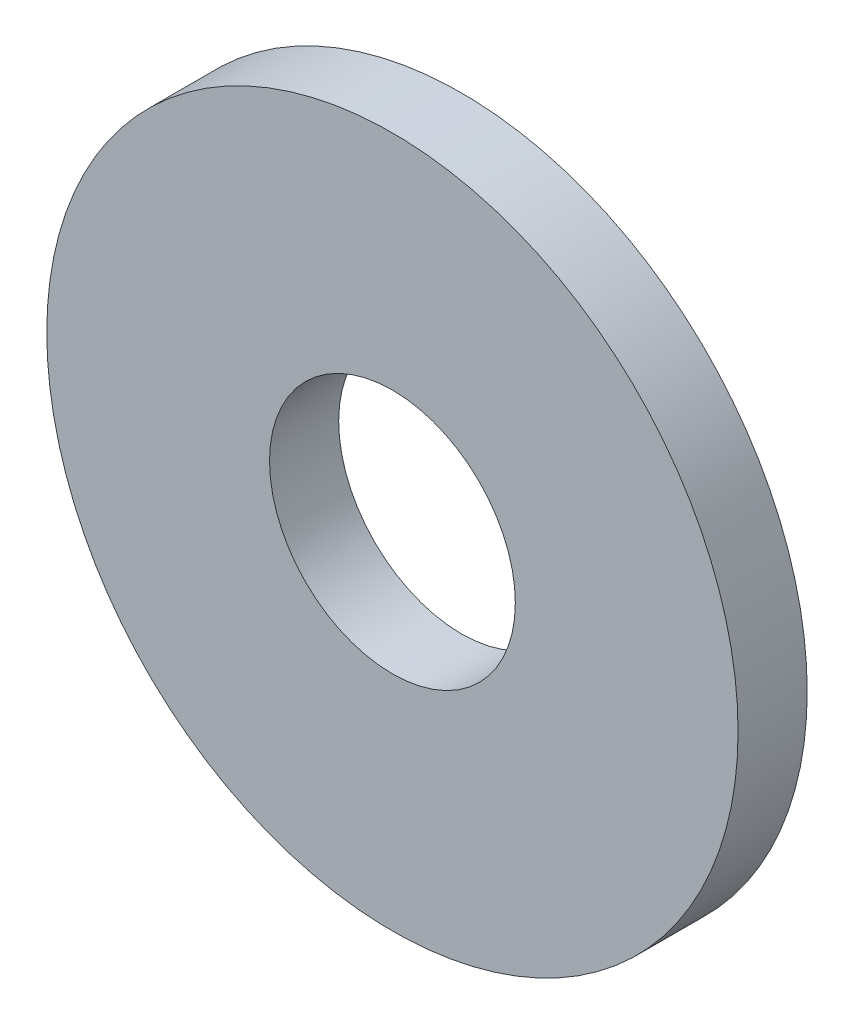
ISO-10303-21;
HEADER;
FILE_DESCRIPTION(('STEP AP214'),'2;1');
FILE_NAME('part.step','',(''),(''),'','','');
FILE_SCHEMA(('AUTOMOTIVE_DESIGN { 1 0 10303 214 1 1 1 1 }'));
ENDSEC;
DATA;
#1=APPLICATION_CONTEXT('core data for automotive mechanical design processes');
#2=APPLICATION_PROTOCOL_DEFINITION('international standard','automotive_design',2000,#1);
#3=PRODUCT_CONTEXT('',#1,'mechanical');
#4=PRODUCT('Part','Part','',(#3));
#5=PRODUCT_RELATED_PRODUCT_CATEGORY('part','',(#4));
#6=PRODUCT_DEFINITION_FORMATION('','',#4);
#7=PRODUCT_DEFINITION_CONTEXT('part definition',#1,'design');
#8=PRODUCT_DEFINITION('design','',#6,#7);
#9=PRODUCT_DEFINITION_SHAPE('','',#8);
#10=(LENGTH_UNIT() NAMED_UNIT(*) SI_UNIT(.MILLI.,.METRE.));
#11=(NAMED_UNIT(*) PLANE_ANGLE_UNIT() SI_UNIT($,.RADIAN.));
#12=(NAMED_UNIT(*) SI_UNIT($,.STERADIAN.) SOLID_ANGLE_UNIT());
#13=UNCERTAINTY_MEASURE_WITH_UNIT(LENGTH_MEASURE(1.E-05),#10,'distance_accuracy_value','');
#14=(GEOMETRIC_REPRESENTATION_CONTEXT(3) GLOBAL_UNCERTAINTY_ASSIGNED_CONTEXT((#13)) GLOBAL_UNIT_ASSIGNED_CONTEXT((#10,
#11,#12)) REPRESENTATION_CONTEXT('',''));
#15=CARTESIAN_POINT('',(0.,0.,0.));
#16=DIRECTION('',(0.,0.,1.));
#17=DIRECTION('',(1.,0.,0.));
#18=AXIS2_PLACEMENT_3D('',#15,#16,#17);
#19=CARTESIAN_POINT('',(0.,0.,1.8));
#20=DIRECTION('',(0.,0.,1.));
#21=DIRECTION('',(1.,0.,0.));
#22=AXIS2_PLACEMENT_3D('',#19,#20,#21);
#23=PLANE('',#22);
#24=CARTESIAN_POINT('',(0.,0.,1.8));
#25=DIRECTION('',(0.,0.,1.));
#26=DIRECTION('',(1.,0.,0.));
#27=AXIS2_PLACEMENT_3D('',#24,#25,#26);
#28=CIRCLE('',#27,9.);
#29=CARTESIAN_POINT('',(9.,0.,1.8));
#30=VERTEX_POINT('',#29);
#31=EDGE_CURVE('E10',#30,#30,#28,.T.);
#32=ORIENTED_EDGE('',*,*,#31,.T.);
#33=EDGE_LOOP('',(#32));
#34=FACE_BOUND('',#33,.T.);
#35=CARTESIAN_POINT('',(0.,0.,1.8));
#36=DIRECTION('',(0.,0.,1.));
#37=DIRECTION('',(1.,0.,0.));
#38=AXIS2_PLACEMENT_3D('',#35,#36,#37);
#39=CIRCLE('',#38,3.2);
#40=CARTESIAN_POINT('',(3.2,0.,1.8));
#41=VERTEX_POINT('',#40);
#42=EDGE_CURVE('E41',#41,#41,#39,.T.);
#43=ORIENTED_EDGE('',*,*,#42,.F.);
#44=EDGE_LOOP('',(#43));
#45=FACE_BOUND('',#44,.T.);
#46=ADVANCED_FACE('F30',(#34,#45),#23,.T.);
#47=CARTESIAN_POINT('',(0.,0.,0.));
#48=DIRECTION('',(0.,0.,1.));
#49=DIRECTION('',(1.,0.,0.));
#50=AXIS2_PLACEMENT_3D('',#47,#48,#49);
#51=PLANE('',#50);
#52=CARTESIAN_POINT('',(0.,0.,0.));
#53=DIRECTION('',(0.,0.,1.));
#54=DIRECTION('',(1.,0.,0.));
#55=AXIS2_PLACEMENT_3D('',#52,#53,#54);
#56=CIRCLE('',#55,9.);
#57=CARTESIAN_POINT('',(9.,0.,0.));
#58=VERTEX_POINT('',#57);
#59=EDGE_CURVE('E34',#58,#58,#56,.T.);
#60=ORIENTED_EDGE('',*,*,#59,.F.);
#61=EDGE_LOOP('',(#60));
#62=FACE_BOUND('',#61,.T.);
#63=CARTESIAN_POINT('',(0.,0.,0.));
#64=DIRECTION('',(0.,0.,1.));
#65=DIRECTION('',(1.,0.,0.));
#66=AXIS2_PLACEMENT_3D('',#63,#64,#65);
#67=CIRCLE('',#66,3.2);
#68=CARTESIAN_POINT('',(3.2,0.,0.));
#69=VERTEX_POINT('',#68);
#70=EDGE_CURVE('E43',#69,#69,#67,.T.);
#71=ORIENTED_EDGE('',*,*,#70,.T.);
#72=EDGE_LOOP('',(#71));
#73=FACE_BOUND('',#72,.T.);
#74=ADVANCED_FACE('F53',(#62,#73),#51,.F.);
#75=CARTESIAN_POINT('',(0.,0.,1.8));
#76=DIRECTION('',(0.,0.,-1.));
#77=DIRECTION('',(-1.,0.,0.));
#78=AXIS2_PLACEMENT_3D('',#75,#76,#77);
#79=CYLINDRICAL_SURFACE('',#78,9.);
#80=ORIENTED_EDGE('',*,*,#31,.F.);
#81=EDGE_LOOP('',(#80));
#82=FACE_BOUND('',#81,.T.);
#83=ORIENTED_EDGE('',*,*,#59,.T.);
#84=EDGE_LOOP('',(#83));
#85=FACE_BOUND('',#84,.T.);
#86=ADVANCED_FACE('F32',(#82,#85),#79,.T.);
#87=CARTESIAN_POINT('',(0.,0.,1.8));
#88=DIRECTION('',(0.,0.,-1.));
#89=DIRECTION('',(-1.,0.,0.));
#90=AXIS2_PLACEMENT_3D('',#87,#88,#89);
#91=CYLINDRICAL_SURFACE('',#90,3.2);
#92=ORIENTED_EDGE('',*,*,#42,.T.);
#93=EDGE_LOOP('',(#92));
#94=FACE_BOUND('',#93,.T.);
#95=ORIENTED_EDGE('',*,*,#70,.F.);
#96=EDGE_LOOP('',(#95));
#97=FACE_BOUND('',#96,.T.);
#98=ADVANCED_FACE('F49',(#94,#97),#91,.F.);
#99=CLOSED_SHELL('',(#46,#74,#86,#98));
#100=MANIFOLD_SOLID_BREP('B2',#99);
#101=ADVANCED_BREP_SHAPE_REPRESENTATION('',(#18,#100),#14);
#102=SHAPE_DEFINITION_REPRESENTATION(#9,#101);
ENDSEC;
END-ISO-10303-21;
